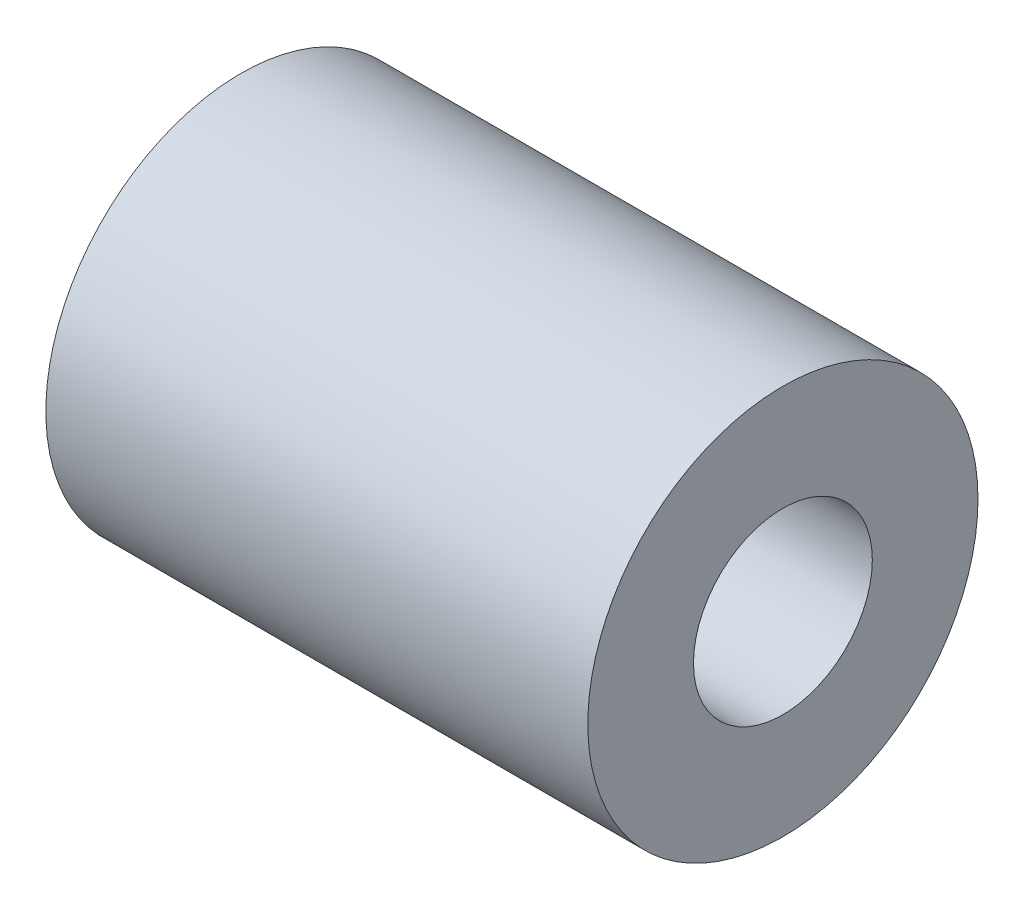
ISO-10303-21;
HEADER;
FILE_DESCRIPTION(('STEP AP214'),'2;1');
FILE_NAME('part.step','',(''),(''),'','','');
FILE_SCHEMA(('AUTOMOTIVE_DESIGN { 1 0 10303 214 1 1 1 1 }'));
ENDSEC;
DATA;
#1=APPLICATION_CONTEXT('core data for automotive mechanical design processes');
#2=APPLICATION_PROTOCOL_DEFINITION('international standard','automotive_design',2000,#1);
#3=PRODUCT_CONTEXT('',#1,'mechanical');
#4=PRODUCT('Part','Part','',(#3));
#5=PRODUCT_RELATED_PRODUCT_CATEGORY('part','',(#4));
#6=PRODUCT_DEFINITION_FORMATION('','',#4);
#7=PRODUCT_DEFINITION_CONTEXT('part definition',#1,'design');
#8=PRODUCT_DEFINITION('design','',#6,#7);
#9=PRODUCT_DEFINITION_SHAPE('','',#8);
#10=(LENGTH_UNIT() NAMED_UNIT(*) SI_UNIT(.MILLI.,.METRE.));
#11=(NAMED_UNIT(*) PLANE_ANGLE_UNIT() SI_UNIT($,.RADIAN.));
#12=(NAMED_UNIT(*) SI_UNIT($,.STERADIAN.) SOLID_ANGLE_UNIT());
#13=UNCERTAINTY_MEASURE_WITH_UNIT(LENGTH_MEASURE(1.E-05),#10,'distance_accuracy_value','');
#14=(GEOMETRIC_REPRESENTATION_CONTEXT(3) GLOBAL_UNCERTAINTY_ASSIGNED_CONTEXT((#13)) GLOBAL_UNIT_ASSIGNED_CONTEXT((#10,
#11,#12)) REPRESENTATION_CONTEXT('',''));
#15=CARTESIAN_POINT('',(0.,0.,0.));
#16=DIRECTION('',(0.,0.,1.));
#17=DIRECTION('',(1.,0.,0.));
#18=AXIS2_PLACEMENT_3D('',#15,#16,#17);
#19=CARTESIAN_POINT('',(10.,0.,0.));
#20=DIRECTION('',(1.,0.,0.));
#21=DIRECTION('',(0.,0.,-1.));
#22=AXIS2_PLACEMENT_3D('',#19,#20,#21);
#23=PLANE('',#22);
#24=CARTESIAN_POINT('',(10.,0.,0.));
#25=DIRECTION('',(1.,0.,0.));
#26=DIRECTION('',(0.,0.,-1.));
#27=AXIS2_PLACEMENT_3D('',#24,#25,#26);
#28=CIRCLE('',#27,3.6);
#29=CARTESIAN_POINT('',(10.,0.,-3.6));
#30=VERTEX_POINT('',#29);
#31=EDGE_CURVE('E10',#30,#30,#28,.T.);
#32=ORIENTED_EDGE('',*,*,#31,.T.);
#33=EDGE_LOOP('',(#32));
#34=FACE_BOUND('',#33,.T.);
#35=CARTESIAN_POINT('',(10.,0.,0.));
#36=DIRECTION('',(1.,0.,0.));
#37=DIRECTION('',(0.,0.,-1.));
#38=AXIS2_PLACEMENT_3D('',#35,#36,#37);
#39=CIRCLE('',#38,1.65);
#40=CARTESIAN_POINT('',(10.,0.,-1.65));
#41=VERTEX_POINT('',#40);
#42=EDGE_CURVE('E52',#41,#41,#39,.T.);
#43=ORIENTED_EDGE('',*,*,#42,.F.);
#44=EDGE_LOOP('',(#43));
#45=FACE_BOUND('',#44,.T.);
#46=ADVANCED_FACE('F41',(#34,#45),#23,.T.);
#47=CARTESIAN_POINT('',(0.,0.,0.));
#48=DIRECTION('',(1.,0.,0.));
#49=DIRECTION('',(0.,0.,-1.));
#50=AXIS2_PLACEMENT_3D('',#47,#48,#49);
#51=PLANE('',#50);
#52=CARTESIAN_POINT('',(0.,0.,0.));
#53=DIRECTION('',(1.,0.,0.));
#54=DIRECTION('',(0.,0.,-1.));
#55=AXIS2_PLACEMENT_3D('',#52,#53,#54);
#56=CIRCLE('',#55,3.6);
#57=CARTESIAN_POINT('',(0.,0.,-3.6));
#58=VERTEX_POINT('',#57);
#59=EDGE_CURVE('E45',#58,#58,#56,.T.);
#60=ORIENTED_EDGE('',*,*,#59,.F.);
#61=EDGE_LOOP('',(#60));
#62=FACE_BOUND('',#61,.T.);
#63=CARTESIAN_POINT('',(0.,0.,0.));
#64=DIRECTION('',(1.,0.,0.));
#65=DIRECTION('',(0.,0.,-1.));
#66=AXIS2_PLACEMENT_3D('',#63,#64,#65);
#67=CIRCLE('',#66,1.65);
#68=CARTESIAN_POINT('',(0.,0.,-1.65));
#69=VERTEX_POINT('',#68);
#70=EDGE_CURVE('E54',#69,#69,#67,.T.);
#71=ORIENTED_EDGE('',*,*,#70,.T.);
#72=EDGE_LOOP('',(#71));
#73=FACE_BOUND('',#72,.T.);
#74=ADVANCED_FACE('F64',(#62,#73),#51,.F.);
#75=CARTESIAN_POINT('',(10.,0.,0.));
#76=DIRECTION('',(-1.,0.,0.));
#77=DIRECTION('',(0.,0.,1.));
#78=AXIS2_PLACEMENT_3D('',#75,#76,#77);
#79=CYLINDRICAL_SURFACE('',#78,3.6);
#80=ORIENTED_EDGE('',*,*,#31,.F.);
#81=EDGE_LOOP('',(#80));
#82=FACE_BOUND('',#81,.T.);
#83=ORIENTED_EDGE('',*,*,#59,.T.);
#84=EDGE_LOOP('',(#83));
#85=FACE_BOUND('',#84,.T.);
#86=ADVANCED_FACE('F43',(#82,#85),#79,.T.);
#87=CARTESIAN_POINT('',(10.,0.,0.));
#88=DIRECTION('',(-1.,0.,0.));
#89=DIRECTION('',(0.,0.,1.));
#90=AXIS2_PLACEMENT_3D('',#87,#88,#89);
#91=CYLINDRICAL_SURFACE('',#90,1.65);
#92=ORIENTED_EDGE('',*,*,#42,.T.);
#93=EDGE_LOOP('',(#92));
#94=FACE_BOUND('',#93,.T.);
#95=ORIENTED_EDGE('',*,*,#70,.F.);
#96=EDGE_LOOP('',(#95));
#97=FACE_BOUND('',#96,.T.);
#98=ADVANCED_FACE('F60',(#94,#97),#91,.F.);
#99=CLOSED_SHELL('',(#46,#74,#86,#98));
#100=MANIFOLD_SOLID_BREP('B2',#99);
#101=ADVANCED_BREP_SHAPE_REPRESENTATION('',(#18,#100),#14);
#102=SHAPE_DEFINITION_REPRESENTATION(#9,#101);
ENDSEC;
END-ISO-10303-21;
